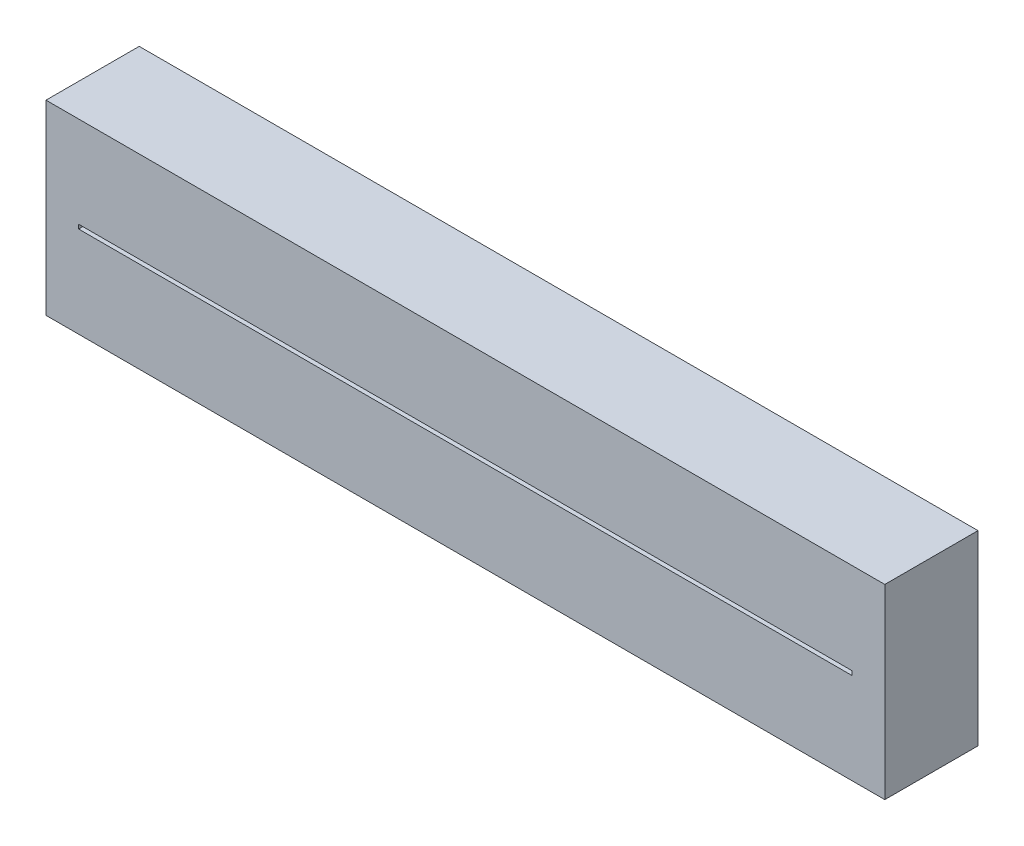
ISO-10303-21;
HEADER;
FILE_DESCRIPTION(('STEP AP214'),'2;1');
FILE_NAME('part.step','',(''),(''),'','','');
FILE_SCHEMA(('AUTOMOTIVE_DESIGN { 1 0 10303 214 1 1 1 1 }'));
ENDSEC;
DATA;
#1=APPLICATION_CONTEXT('core data for automotive mechanical design processes');
#2=APPLICATION_PROTOCOL_DEFINITION('international standard','automotive_design',2000,#1);
#3=PRODUCT_CONTEXT('',#1,'mechanical');
#4=PRODUCT('Part','Part','',(#3));
#5=PRODUCT_RELATED_PRODUCT_CATEGORY('part','',(#4));
#6=PRODUCT_DEFINITION_FORMATION('','',#4);
#7=PRODUCT_DEFINITION_CONTEXT('part definition',#1,'design');
#8=PRODUCT_DEFINITION('design','',#6,#7);
#9=PRODUCT_DEFINITION_SHAPE('','',#8);
#10=(LENGTH_UNIT() NAMED_UNIT(*) SI_UNIT(.MILLI.,.METRE.));
#11=(NAMED_UNIT(*) PLANE_ANGLE_UNIT() SI_UNIT($,.RADIAN.));
#12=(NAMED_UNIT(*) SI_UNIT($,.STERADIAN.) SOLID_ANGLE_UNIT());
#13=UNCERTAINTY_MEASURE_WITH_UNIT(LENGTH_MEASURE(1.E-05),#10,'distance_accuracy_value','');
#14=(GEOMETRIC_REPRESENTATION_CONTEXT(3) GLOBAL_UNCERTAINTY_ASSIGNED_CONTEXT((#13)) GLOBAL_UNIT_ASSIGNED_CONTEXT((#10,
#11,#12)) REPRESENTATION_CONTEXT('',''));
#15=CARTESIAN_POINT('',(0.,0.,0.));
#16=DIRECTION('',(0.,0.,1.));
#17=DIRECTION('',(1.,0.,0.));
#18=AXIS2_PLACEMENT_3D('',#15,#16,#17);
#19=CARTESIAN_POINT('',(45.,10.,10.));
#20=DIRECTION('',(-1.,0.,0.));
#21=DIRECTION('',(0.,0.,1.));
#22=AXIS2_PLACEMENT_3D('',#19,#20,#21);
#23=PLANE('',#22);
#24=DIRECTION('',(0.,1.,0.));
#25=VECTOR('',#24,1.);
#26=CARTESIAN_POINT('',(45.,10.,0.));
#27=LINE('',#26,#25);
#28=CARTESIAN_POINT('',(45.,-10.,0.));
#29=VERTEX_POINT('',#28);
#30=CARTESIAN_POINT('',(45.,10.,0.));
#31=VERTEX_POINT('',#30);
#32=EDGE_CURVE('E141',#29,#31,#27,.T.);
#33=ORIENTED_EDGE('',*,*,#32,.T.);
#34=DIRECTION('',(0.,0.,-1.));
#35=VECTOR('',#34,1.);
#36=CARTESIAN_POINT('',(45.,10.,10.));
#37=LINE('',#36,#35);
#38=CARTESIAN_POINT('',(45.,10.,10.));
#39=VERTEX_POINT('',#38);
#40=EDGE_CURVE('E11',#39,#31,#37,.T.);
#41=ORIENTED_EDGE('',*,*,#40,.F.);
#42=DIRECTION('',(0.,1.,0.));
#43=VECTOR('',#42,1.);
#44=CARTESIAN_POINT('',(45.,10.,10.));
#45=LINE('',#44,#43);
#46=CARTESIAN_POINT('',(45.,-10.,10.));
#47=VERTEX_POINT('',#46);
#48=EDGE_CURVE('E145',#47,#39,#45,.T.);
#49=ORIENTED_EDGE('',*,*,#48,.F.);
#50=DIRECTION('',(0.,0.,-1.));
#51=VECTOR('',#50,1.);
#52=CARTESIAN_POINT('',(45.,-10.,10.));
#53=LINE('',#52,#51);
#54=EDGE_CURVE('E151',#47,#29,#53,.T.);
#55=ORIENTED_EDGE('',*,*,#54,.T.);
#56=EDGE_LOOP('',(#33,#41,#49,#55));
#57=FACE_BOUND('',#56,.T.);
#58=ADVANCED_FACE('F33',(#57),#23,.F.);
#59=CARTESIAN_POINT('',(-45.,10.,10.));
#60=DIRECTION('',(0.,-1.,0.));
#61=DIRECTION('',(0.,0.,-1.));
#62=AXIS2_PLACEMENT_3D('',#59,#60,#61);
#63=PLANE('',#62);
#64=DIRECTION('',(-1.,0.,0.));
#65=VECTOR('',#64,1.);
#66=CARTESIAN_POINT('',(-45.,10.,0.));
#67=LINE('',#66,#65);
#68=CARTESIAN_POINT('',(-45.,10.,0.));
#69=VERTEX_POINT('',#68);
#70=EDGE_CURVE('E154',#31,#69,#67,.T.);
#71=ORIENTED_EDGE('',*,*,#70,.T.);
#72=DIRECTION('',(0.,0.,-1.));
#73=VECTOR('',#72,1.);
#74=CARTESIAN_POINT('',(-45.,10.,10.));
#75=LINE('',#74,#73);
#76=CARTESIAN_POINT('',(-45.,10.,10.));
#77=VERTEX_POINT('',#76);
#78=EDGE_CURVE('E40',#77,#69,#75,.T.);
#79=ORIENTED_EDGE('',*,*,#78,.F.);
#80=DIRECTION('',(-1.,0.,0.));
#81=VECTOR('',#80,1.);
#82=CARTESIAN_POINT('',(-45.,10.,10.));
#83=LINE('',#82,#81);
#84=EDGE_CURVE('E84',#39,#77,#83,.T.);
#85=ORIENTED_EDGE('',*,*,#84,.F.);
#86=ORIENTED_EDGE('',*,*,#40,.T.);
#87=EDGE_LOOP('',(#71,#79,#85,#86));
#88=FACE_BOUND('',#87,.T.);
#89=ADVANCED_FACE('F183',(#88),#63,.F.);
#90=CARTESIAN_POINT('',(-45.,10.,10.));
#91=DIRECTION('',(1.,0.,0.));
#92=DIRECTION('',(0.,0.,-1.));
#93=AXIS2_PLACEMENT_3D('',#90,#91,#92);
#94=PLANE('',#93);
#95=DIRECTION('',(0.,-1.,0.));
#96=VECTOR('',#95,1.);
#97=CARTESIAN_POINT('',(-45.,10.,0.));
#98=LINE('',#97,#96);
#99=CARTESIAN_POINT('',(-45.,-10.,0.));
#100=VERTEX_POINT('',#99);
#101=EDGE_CURVE('E156',#69,#100,#98,.T.);
#102=ORIENTED_EDGE('',*,*,#101,.T.);
#103=DIRECTION('',(0.,0.,-1.));
#104=VECTOR('',#103,1.);
#105=CARTESIAN_POINT('',(-45.,-10.,10.));
#106=LINE('',#105,#104);
#107=CARTESIAN_POINT('',(-45.,-10.,10.));
#108=VERTEX_POINT('',#107);
#109=EDGE_CURVE('E160',#108,#100,#106,.T.);
#110=ORIENTED_EDGE('',*,*,#109,.F.);
#111=DIRECTION('',(0.,-1.,0.));
#112=VECTOR('',#111,1.);
#113=CARTESIAN_POINT('',(-45.,10.,10.));
#114=LINE('',#113,#112);
#115=EDGE_CURVE('E148',#77,#108,#114,.T.);
#116=ORIENTED_EDGE('',*,*,#115,.F.);
#117=ORIENTED_EDGE('',*,*,#78,.T.);
#118=EDGE_LOOP('',(#102,#110,#116,#117));
#119=FACE_BOUND('',#118,.T.);
#120=ADVANCED_FACE('F165',(#119),#94,.F.);
#121=CARTESIAN_POINT('',(-45.,-10.,10.));
#122=DIRECTION('',(0.,1.,0.));
#123=DIRECTION('',(0.,0.,1.));
#124=AXIS2_PLACEMENT_3D('',#121,#122,#123);
#125=PLANE('',#124);
#126=DIRECTION('',(1.,0.,0.));
#127=VECTOR('',#126,1.);
#128=CARTESIAN_POINT('',(-45.,-10.,0.));
#129=LINE('',#128,#127);
#130=EDGE_CURVE('E77',#100,#29,#129,.T.);
#131=ORIENTED_EDGE('',*,*,#130,.T.);
#132=ORIENTED_EDGE('',*,*,#54,.F.);
#133=DIRECTION('',(1.,0.,0.));
#134=VECTOR('',#133,1.);
#135=CARTESIAN_POINT('',(-45.,-10.,10.));
#136=LINE('',#135,#134);
#137=EDGE_CURVE('E56',#108,#47,#136,.T.);
#138=ORIENTED_EDGE('',*,*,#137,.F.);
#139=ORIENTED_EDGE('',*,*,#109,.T.);
#140=EDGE_LOOP('',(#131,#132,#138,#139));
#141=FACE_BOUND('',#140,.T.);
#142=ADVANCED_FACE('F173',(#141),#125,.F.);
#143=CARTESIAN_POINT('',(0.,0.,10.));
#144=DIRECTION('',(0.,0.,1.));
#145=DIRECTION('',(1.,0.,0.));
#146=AXIS2_PLACEMENT_3D('',#143,#144,#145);
#147=PLANE('',#146);
#148=DIRECTION('',(0.,1.,0.));
#149=VECTOR('',#148,1.);
#150=CARTESIAN_POINT('',(41.5,0.225,10.));
#151=LINE('',#150,#149);
#152=CARTESIAN_POINT('',(41.5,-0.225,10.));
#153=VERTEX_POINT('',#152);
#154=CARTESIAN_POINT('',(41.5,0.225,10.));
#155=VERTEX_POINT('',#154);
#156=EDGE_CURVE('E47',#153,#155,#151,.T.);
#157=ORIENTED_EDGE('',*,*,#156,.F.);
#158=DIRECTION('',(1.,0.,0.));
#159=VECTOR('',#158,1.);
#160=CARTESIAN_POINT('',(-41.5,-0.225,10.));
#161=LINE('',#160,#159);
#162=CARTESIAN_POINT('',(-41.5,-0.225,10.));
#163=VERTEX_POINT('',#162);
#164=EDGE_CURVE('E126',#163,#153,#161,.T.);
#165=ORIENTED_EDGE('',*,*,#164,.F.);
#166=DIRECTION('',(0.,-1.,0.));
#167=VECTOR('',#166,1.);
#168=CARTESIAN_POINT('',(-41.5,0.225,10.));
#169=LINE('',#168,#167);
#170=CARTESIAN_POINT('',(-41.5,0.225,10.));
#171=VERTEX_POINT('',#170);
#172=EDGE_CURVE('E129',#171,#163,#169,.T.);
#173=ORIENTED_EDGE('',*,*,#172,.F.);
#174=DIRECTION('',(-1.,0.,0.));
#175=VECTOR('',#174,1.);
#176=CARTESIAN_POINT('',(-41.5,0.225,10.));
#177=LINE('',#176,#175);
#178=EDGE_CURVE('E135',#155,#171,#177,.T.);
#179=ORIENTED_EDGE('',*,*,#178,.F.);
#180=EDGE_LOOP('',(#157,#165,#173,#179));
#181=FACE_BOUND('',#180,.T.);
#182=ORIENTED_EDGE('',*,*,#48,.T.);
#183=ORIENTED_EDGE('',*,*,#84,.T.);
#184=ORIENTED_EDGE('',*,*,#115,.T.);
#185=ORIENTED_EDGE('',*,*,#137,.T.);
#186=EDGE_LOOP('',(#182,#183,#184,#185));
#187=FACE_BOUND('',#186,.T.);
#188=ADVANCED_FACE('F175',(#181,#187),#147,.T.);
#189=CARTESIAN_POINT('',(0.,0.,0.));
#190=DIRECTION('',(0.,0.,1.));
#191=DIRECTION('',(1.,0.,0.));
#192=AXIS2_PLACEMENT_3D('',#189,#190,#191);
#193=PLANE('',#192);
#194=ORIENTED_EDGE('',*,*,#32,.F.);
#195=ORIENTED_EDGE('',*,*,#130,.F.);
#196=ORIENTED_EDGE('',*,*,#101,.F.);
#197=ORIENTED_EDGE('',*,*,#70,.F.);
#198=EDGE_LOOP('',(#194,#195,#196,#197));
#199=FACE_BOUND('',#198,.T.);
#200=ADVANCED_FACE('F169',(#199),#193,.F.);
#201=CARTESIAN_POINT('',(41.5,0.225,5.));
#202=DIRECTION('',(1.,0.,0.));
#203=DIRECTION('',(0.,0.,-1.));
#204=AXIS2_PLACEMENT_3D('',#201,#202,#203);
#205=PLANE('',#204);
#206=ORIENTED_EDGE('',*,*,#156,.T.);
#207=DIRECTION('',(0.,0.,1.));
#208=VECTOR('',#207,1.);
#209=CARTESIAN_POINT('',(41.5,0.225,5.));
#210=LINE('',#209,#208);
#211=CARTESIAN_POINT('',(41.5,0.225,5.));
#212=VERTEX_POINT('',#211);
#213=EDGE_CURVE('E104',#212,#155,#210,.T.);
#214=ORIENTED_EDGE('',*,*,#213,.F.);
#215=DIRECTION('',(0.,1.,0.));
#216=VECTOR('',#215,1.);
#217=CARTESIAN_POINT('',(41.5,0.225,5.));
#218=LINE('',#217,#216);
#219=CARTESIAN_POINT('',(41.5,-0.225,5.));
#220=VERTEX_POINT('',#219);
#221=EDGE_CURVE('E108',#220,#212,#218,.T.);
#222=ORIENTED_EDGE('',*,*,#221,.F.);
#223=DIRECTION('',(0.,0.,1.));
#224=VECTOR('',#223,1.);
#225=CARTESIAN_POINT('',(41.5,-0.225,5.));
#226=LINE('',#225,#224);
#227=EDGE_CURVE('E139',#220,#153,#226,.T.);
#228=ORIENTED_EDGE('',*,*,#227,.T.);
#229=EDGE_LOOP('',(#206,#214,#222,#228));
#230=FACE_BOUND('',#229,.T.);
#231=ADVANCED_FACE('F106',(#230),#205,.F.);
#232=CARTESIAN_POINT('',(-41.5,-0.225,5.));
#233=DIRECTION('',(0.,-1.,0.));
#234=DIRECTION('',(0.,0.,-1.));
#235=AXIS2_PLACEMENT_3D('',#232,#233,#234);
#236=PLANE('',#235);
#237=ORIENTED_EDGE('',*,*,#164,.T.);
#238=ORIENTED_EDGE('',*,*,#227,.F.);
#239=DIRECTION('',(1.,0.,0.));
#240=VECTOR('',#239,1.);
#241=CARTESIAN_POINT('',(-41.5,-0.225,5.));
#242=LINE('',#241,#240);
#243=CARTESIAN_POINT('',(-41.5,-0.225,5.));
#244=VERTEX_POINT('',#243);
#245=EDGE_CURVE('E114',#244,#220,#242,.T.);
#246=ORIENTED_EDGE('',*,*,#245,.F.);
#247=DIRECTION('',(0.,0.,1.));
#248=VECTOR('',#247,1.);
#249=CARTESIAN_POINT('',(-41.5,-0.225,5.));
#250=LINE('',#249,#248);
#251=EDGE_CURVE('E142',#244,#163,#250,.T.);
#252=ORIENTED_EDGE('',*,*,#251,.T.);
#253=EDGE_LOOP('',(#237,#238,#246,#252));
#254=FACE_BOUND('',#253,.T.);
#255=ADVANCED_FACE('F222',(#254),#236,.F.);
#256=CARTESIAN_POINT('',(-41.5,0.225,5.));
#257=DIRECTION('',(-1.,0.,0.));
#258=DIRECTION('',(0.,0.,1.));
#259=AXIS2_PLACEMENT_3D('',#256,#257,#258);
#260=PLANE('',#259);
#261=ORIENTED_EDGE('',*,*,#172,.T.);
#262=ORIENTED_EDGE('',*,*,#251,.F.);
#263=DIRECTION('',(0.,-1.,0.));
#264=VECTOR('',#263,1.);
#265=CARTESIAN_POINT('',(-41.5,0.225,5.));
#266=LINE('',#265,#264);
#267=CARTESIAN_POINT('',(-41.5,0.225,5.));
#268=VERTEX_POINT('',#267);
#269=EDGE_CURVE('E122',#268,#244,#266,.T.);
#270=ORIENTED_EDGE('',*,*,#269,.F.);
#271=DIRECTION('',(0.,0.,1.));
#272=VECTOR('',#271,1.);
#273=CARTESIAN_POINT('',(-41.5,0.225,5.));
#274=LINE('',#273,#272);
#275=EDGE_CURVE('E113',#268,#171,#274,.T.);
#276=ORIENTED_EDGE('',*,*,#275,.T.);
#277=EDGE_LOOP('',(#261,#262,#270,#276));
#278=FACE_BOUND('',#277,.T.);
#279=ADVANCED_FACE('F231',(#278),#260,.F.);
#280=CARTESIAN_POINT('',(-41.5,0.225,5.));
#281=DIRECTION('',(0.,1.,0.));
#282=DIRECTION('',(0.,0.,1.));
#283=AXIS2_PLACEMENT_3D('',#280,#281,#282);
#284=PLANE('',#283);
#285=ORIENTED_EDGE('',*,*,#178,.T.);
#286=ORIENTED_EDGE('',*,*,#275,.F.);
#287=DIRECTION('',(-1.,0.,0.));
#288=VECTOR('',#287,1.);
#289=CARTESIAN_POINT('',(-41.5,0.225,5.));
#290=LINE('',#289,#288);
#291=EDGE_CURVE('E117',#212,#268,#290,.T.);
#292=ORIENTED_EDGE('',*,*,#291,.F.);
#293=ORIENTED_EDGE('',*,*,#213,.T.);
#294=EDGE_LOOP('',(#285,#286,#292,#293));
#295=FACE_BOUND('',#294,.T.);
#296=ADVANCED_FACE('F118',(#295),#284,.F.);
#297=CARTESIAN_POINT('',(0.,0.,5.));
#298=DIRECTION('',(0.,0.,1.));
#299=DIRECTION('',(1.,0.,0.));
#300=AXIS2_PLACEMENT_3D('',#297,#298,#299);
#301=PLANE('',#300);
#302=ORIENTED_EDGE('',*,*,#221,.T.);
#303=ORIENTED_EDGE('',*,*,#291,.T.);
#304=ORIENTED_EDGE('',*,*,#269,.T.);
#305=ORIENTED_EDGE('',*,*,#245,.T.);
#306=EDGE_LOOP('',(#302,#303,#304,#305));
#307=FACE_BOUND('',#306,.T.);
#308=ADVANCED_FACE('F124',(#307),#301,.T.);
#309=CLOSED_SHELL('',(#58,#89,#120,#142,#188,#200,#231,#255,#279,#296,#308));
#310=MANIFOLD_SOLID_BREP('B2',#309);
#311=ADVANCED_BREP_SHAPE_REPRESENTATION('',(#18,#310),#14);
#312=SHAPE_DEFINITION_REPRESENTATION(#9,#311);
ENDSEC;
END-ISO-10303-21;
